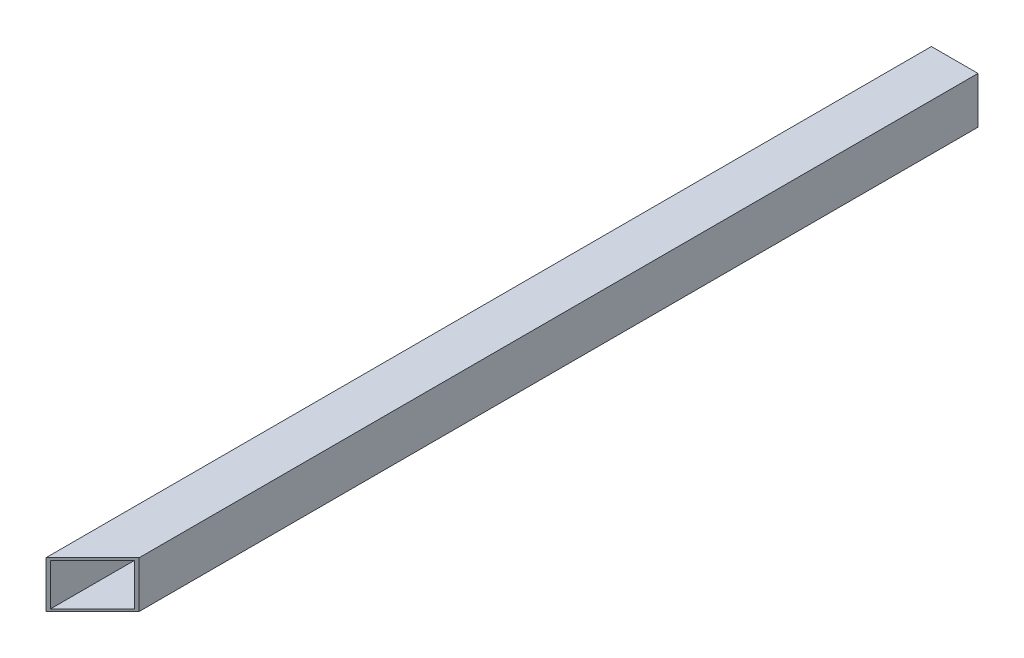
ISO-10303-21;
HEADER;
FILE_DESCRIPTION(('STEP AP214'),'2;1');
FILE_NAME('part.step','',(''),(''),'','','');
FILE_SCHEMA(('AUTOMOTIVE_DESIGN { 1 0 10303 214 1 1 1 1 }'));
ENDSEC;
DATA;
#1=APPLICATION_CONTEXT('core data for automotive mechanical design processes');
#2=APPLICATION_PROTOCOL_DEFINITION('international standard','automotive_design',2000,#1);
#3=PRODUCT_CONTEXT('',#1,'mechanical');
#4=PRODUCT('Part','Part','',(#3));
#5=PRODUCT_RELATED_PRODUCT_CATEGORY('part','',(#4));
#6=PRODUCT_DEFINITION_FORMATION('','',#4);
#7=PRODUCT_DEFINITION_CONTEXT('part definition',#1,'design');
#8=PRODUCT_DEFINITION('design','',#6,#7);
#9=PRODUCT_DEFINITION_SHAPE('','',#8);
#10=(LENGTH_UNIT() NAMED_UNIT(*) SI_UNIT(.MILLI.,.METRE.));
#11=(NAMED_UNIT(*) PLANE_ANGLE_UNIT() SI_UNIT($,.RADIAN.));
#12=(NAMED_UNIT(*) SI_UNIT($,.STERADIAN.) SOLID_ANGLE_UNIT());
#13=UNCERTAINTY_MEASURE_WITH_UNIT(LENGTH_MEASURE(1.E-05),#10,'distance_accuracy_value','');
#14=(GEOMETRIC_REPRESENTATION_CONTEXT(3) GLOBAL_UNCERTAINTY_ASSIGNED_CONTEXT((#13)) GLOBAL_UNIT_ASSIGNED_CONTEXT((#10,
#11,#12)) REPRESENTATION_CONTEXT('',''));
#15=CARTESIAN_POINT('',(0.,0.,0.));
#16=DIRECTION('',(0.,0.,1.));
#17=DIRECTION('',(1.,0.,0.));
#18=AXIS2_PLACEMENT_3D('',#15,#16,#17);
#19=CARTESIAN_POINT('',(0.,0.,0.));
#20=DIRECTION('',(0.,0.,-1.));
#21=DIRECTION('',(-1.,0.,0.));
#22=AXIS2_PLACEMENT_3D('',#19,#20,#21);
#23=PLANE('',#22);
#24=DIRECTION('',(0.,1.,0.));
#25=VECTOR('',#24,1.);
#26=CARTESIAN_POINT('',(12.7,-12.7,0.));
#27=LINE('',#26,#25);
#28=CARTESIAN_POINT('',(12.7,-12.7,0.));
#29=VERTEX_POINT('',#28);
#30=CARTESIAN_POINT('',(12.7,12.7,0.));
#31=VERTEX_POINT('',#30);
#32=EDGE_CURVE('E146',#29,#31,#27,.T.);
#33=ORIENTED_EDGE('',*,*,#32,.F.);
#34=DIRECTION('',(1.,0.,0.));
#35=VECTOR('',#34,1.);
#36=CARTESIAN_POINT('',(-12.7,-12.7,0.));
#37=LINE('',#36,#35);
#38=CARTESIAN_POINT('',(-12.7,-12.7,0.));
#39=VERTEX_POINT('',#38);
#40=EDGE_CURVE('E134',#39,#29,#37,.T.);
#41=ORIENTED_EDGE('',*,*,#40,.F.);
#42=DIRECTION('',(0.,-1.,0.));
#43=VECTOR('',#42,1.);
#44=CARTESIAN_POINT('',(-12.7,-12.7,0.));
#45=LINE('',#44,#43);
#46=CARTESIAN_POINT('',(-12.7,12.7,0.));
#47=VERTEX_POINT('',#46);
#48=EDGE_CURVE('E140',#47,#39,#45,.T.);
#49=ORIENTED_EDGE('',*,*,#48,.F.);
#50=DIRECTION('',(-1.,0.,0.));
#51=VECTOR('',#50,1.);
#52=CARTESIAN_POINT('',(-12.7,12.7,0.));
#53=LINE('',#52,#51);
#54=EDGE_CURVE('E123',#31,#47,#53,.T.);
#55=ORIENTED_EDGE('',*,*,#54,.F.);
#56=EDGE_LOOP('',(#33,#41,#49,#55));
#57=FACE_BOUND('',#56,.T.);
#58=DIRECTION('',(1.,0.,0.));
#59=VECTOR('',#58,1.);
#60=CARTESIAN_POINT('',(-11.4554,-11.4554,0.));
#61=LINE('',#60,#59);
#62=CARTESIAN_POINT('',(-11.4554,-11.4554,0.));
#63=VERTEX_POINT('',#62);
#64=CARTESIAN_POINT('',(11.4554,-11.4554,0.));
#65=VERTEX_POINT('',#64);
#66=EDGE_CURVE('E189',#63,#65,#61,.T.);
#67=ORIENTED_EDGE('',*,*,#66,.T.);
#68=DIRECTION('',(0.,1.,0.));
#69=VECTOR('',#68,1.);
#70=CARTESIAN_POINT('',(11.4554,11.4554,0.));
#71=LINE('',#70,#69);
#72=CARTESIAN_POINT('',(11.4554,11.4554,0.));
#73=VERTEX_POINT('',#72);
#74=EDGE_CURVE('E177',#65,#73,#71,.T.);
#75=ORIENTED_EDGE('',*,*,#74,.T.);
#76=DIRECTION('',(-1.,0.,0.));
#77=VECTOR('',#76,1.);
#78=CARTESIAN_POINT('',(-11.4554,11.4554,0.));
#79=LINE('',#78,#77);
#80=CARTESIAN_POINT('',(-11.4554,11.4554,0.));
#81=VERTEX_POINT('',#80);
#82=EDGE_CURVE('E181',#73,#81,#79,.T.);
#83=ORIENTED_EDGE('',*,*,#82,.T.);
#84=DIRECTION('',(0.,-1.,0.));
#85=VECTOR('',#84,1.);
#86=CARTESIAN_POINT('',(-11.4554,11.4554,0.));
#87=LINE('',#86,#85);
#88=EDGE_CURVE('E185',#81,#63,#87,.T.);
#89=ORIENTED_EDGE('',*,*,#88,.T.);
#90=EDGE_LOOP('',(#67,#75,#83,#89));
#91=FACE_BOUND('',#90,.T.);
#92=ADVANCED_FACE('F41',(#57,#91),#23,.T.);
#93=CARTESIAN_POINT('',(12.7,-12.7,482.6));
#94=DIRECTION('',(-1.,0.,0.));
#95=DIRECTION('',(0.,0.,1.));
#96=AXIS2_PLACEMENT_3D('',#93,#94,#95);
#97=PLANE('',#96);
#98=DIRECTION('',(0.,0.,-1.));
#99=VECTOR('',#98,1.);
#100=CARTESIAN_POINT('',(12.7,12.7,482.6));
#101=LINE('',#100,#99);
#102=CARTESIAN_POINT('',(12.7000000000001,12.7,457.2));
#103=VERTEX_POINT('',#102);
#104=EDGE_CURVE('E50',#103,#31,#101,.T.);
#105=ORIENTED_EDGE('',*,*,#104,.F.);
#106=DIRECTION('',(0.,-1.,0.));
#107=VECTOR('',#106,1.);
#108=CARTESIAN_POINT('',(12.7,-12.7,457.2));
#109=LINE('',#108,#107);
#110=CARTESIAN_POINT('',(12.7000000000001,-12.7,457.2));
#111=VERTEX_POINT('',#110);
#112=EDGE_CURVE('E113',#103,#111,#109,.T.);
#113=ORIENTED_EDGE('',*,*,#112,.T.);
#114=DIRECTION('',(0.,0.,-1.));
#115=VECTOR('',#114,1.);
#116=CARTESIAN_POINT('',(12.7,-12.7,482.6));
#117=LINE('',#116,#115);
#118=EDGE_CURVE('E133',#111,#29,#117,.T.);
#119=ORIENTED_EDGE('',*,*,#118,.T.);
#120=ORIENTED_EDGE('',*,*,#32,.T.);
#121=EDGE_LOOP('',(#105,#113,#119,#120));
#122=FACE_BOUND('',#121,.T.);
#123=ADVANCED_FACE('F43',(#122),#97,.F.);
#124=CARTESIAN_POINT('',(-12.7,12.7,482.6));
#125=DIRECTION('',(0.,-1.,0.));
#126=DIRECTION('',(0.,0.,-1.));
#127=AXIS2_PLACEMENT_3D('',#124,#125,#126);
#128=PLANE('',#127);
#129=DIRECTION('',(0.,0.,-1.));
#130=VECTOR('',#129,1.);
#131=CARTESIAN_POINT('',(-12.7,12.7,482.6));
#132=LINE('',#131,#130);
#133=CARTESIAN_POINT('',(-12.7,12.7,482.6));
#134=VERTEX_POINT('',#133);
#135=EDGE_CURVE('E120',#134,#47,#132,.T.);
#136=ORIENTED_EDGE('',*,*,#135,.F.);
#137=DIRECTION('',(-0.707106781186549,0.,0.707106781186546));
#138=VECTOR('',#137,1.);
#139=CARTESIAN_POINT('',(328.549732600628,12.7,141.350267399373));
#140=LINE('',#139,#138);
#141=EDGE_CURVE('E106',#103,#134,#140,.T.);
#142=ORIENTED_EDGE('',*,*,#141,.F.);
#143=ORIENTED_EDGE('',*,*,#104,.T.);
#144=ORIENTED_EDGE('',*,*,#54,.T.);
#145=EDGE_LOOP('',(#136,#142,#143,#144));
#146=FACE_BOUND('',#145,.T.);
#147=ADVANCED_FACE('F121',(#146),#128,.F.);
#148=CARTESIAN_POINT('',(-12.7,-12.7,482.6));
#149=DIRECTION('',(1.,0.,0.));
#150=DIRECTION('',(0.,0.,-1.));
#151=AXIS2_PLACEMENT_3D('',#148,#149,#150);
#152=PLANE('',#151);
#153=ORIENTED_EDGE('',*,*,#48,.T.);
#154=DIRECTION('',(0.,0.,-1.));
#155=VECTOR('',#154,1.);
#156=CARTESIAN_POINT('',(-12.7,-12.7,482.6));
#157=LINE('',#156,#155);
#158=CARTESIAN_POINT('',(-12.7,-12.7,482.6));
#159=VERTEX_POINT('',#158);
#160=EDGE_CURVE('E127',#159,#39,#157,.T.);
#161=ORIENTED_EDGE('',*,*,#160,.F.);
#162=DIRECTION('',(0.,-1.,0.));
#163=VECTOR('',#162,1.);
#164=CARTESIAN_POINT('',(-12.7,-12.7,482.6));
#165=LINE('',#164,#163);
#166=EDGE_CURVE('E110',#134,#159,#165,.T.);
#167=ORIENTED_EDGE('',*,*,#166,.F.);
#168=ORIENTED_EDGE('',*,*,#135,.T.);
#169=EDGE_LOOP('',(#153,#161,#167,#168));
#170=FACE_BOUND('',#169,.T.);
#171=ADVANCED_FACE('F130',(#170),#152,.F.);
#172=CARTESIAN_POINT('',(-12.7,-12.7,482.6));
#173=DIRECTION('',(0.,1.,0.));
#174=DIRECTION('',(0.,0.,1.));
#175=AXIS2_PLACEMENT_3D('',#172,#173,#174);
#176=PLANE('',#175);
#177=ORIENTED_EDGE('',*,*,#118,.F.);
#178=DIRECTION('',(-0.707106781186549,0.,0.707106781186546));
#179=VECTOR('',#178,1.);
#180=CARTESIAN_POINT('',(328.549732600628,-12.7,141.350267399373));
#181=LINE('',#180,#179);
#182=EDGE_CURVE('E117',#111,#159,#181,.T.);
#183=ORIENTED_EDGE('',*,*,#182,.T.);
#184=ORIENTED_EDGE('',*,*,#160,.T.);
#185=ORIENTED_EDGE('',*,*,#40,.T.);
#186=EDGE_LOOP('',(#177,#183,#184,#185));
#187=FACE_BOUND('',#186,.T.);
#188=ADVANCED_FACE('F163',(#187),#176,.F.);
#189=CARTESIAN_POINT('',(11.4554,11.4554,482.6));
#190=DIRECTION('',(-1.,0.,0.));
#191=DIRECTION('',(0.,-1.,0.));
#192=AXIS2_PLACEMENT_3D('',#189,#190,#191);
#193=PLANE('',#192);
#194=DIRECTION('',(0.,-1.,0.));
#195=VECTOR('',#194,1.);
#196=CARTESIAN_POINT('',(11.4554,11.4554,458.4446));
#197=LINE('',#196,#195);
#198=CARTESIAN_POINT('',(11.4554,11.4554,458.4446));
#199=VERTEX_POINT('',#198);
#200=CARTESIAN_POINT('',(11.4554,-11.4554,458.4446));
#201=VERTEX_POINT('',#200);
#202=EDGE_CURVE('E56',#199,#201,#197,.T.);
#203=ORIENTED_EDGE('',*,*,#202,.F.);
#204=DIRECTION('',(0.,0.,-1.));
#205=VECTOR('',#204,1.);
#206=CARTESIAN_POINT('',(11.4554,11.4554,482.6));
#207=LINE('',#206,#205);
#208=EDGE_CURVE('E144',#199,#73,#207,.T.);
#209=ORIENTED_EDGE('',*,*,#208,.T.);
#210=ORIENTED_EDGE('',*,*,#74,.F.);
#211=DIRECTION('',(0.,0.,-1.));
#212=VECTOR('',#211,1.);
#213=CARTESIAN_POINT('',(11.4554,-11.4554,482.6));
#214=LINE('',#213,#212);
#215=EDGE_CURVE('E63',#201,#65,#214,.T.);
#216=ORIENTED_EDGE('',*,*,#215,.F.);
#217=EDGE_LOOP('',(#203,#209,#210,#216));
#218=FACE_BOUND('',#217,.T.);
#219=ADVANCED_FACE('F207',(#218),#193,.T.);
#220=CARTESIAN_POINT('',(-11.4554,11.4554,482.6));
#221=DIRECTION('',(0.,-1.,0.));
#222=DIRECTION('',(0.,0.,-1.));
#223=AXIS2_PLACEMENT_3D('',#220,#221,#222);
#224=PLANE('',#223);
#225=DIRECTION('',(0.707106781186549,0.,-0.707106781186546));
#226=VECTOR('',#225,1.);
#227=CARTESIAN_POINT('',(-12.0777,11.4554,481.9777));
#228=LINE('',#227,#226);
#229=CARTESIAN_POINT('',(-11.4554,11.4554,481.3554));
#230=VERTEX_POINT('',#229);
#231=EDGE_CURVE('E168',#230,#199,#228,.T.);
#232=ORIENTED_EDGE('',*,*,#231,.F.);
#233=DIRECTION('',(0.,0.,-1.));
#234=VECTOR('',#233,1.);
#235=CARTESIAN_POINT('',(-11.4554,11.4554,482.6));
#236=LINE('',#235,#234);
#237=EDGE_CURVE('E197',#230,#81,#236,.T.);
#238=ORIENTED_EDGE('',*,*,#237,.T.);
#239=ORIENTED_EDGE('',*,*,#82,.F.);
#240=ORIENTED_EDGE('',*,*,#208,.F.);
#241=EDGE_LOOP('',(#232,#238,#239,#240));
#242=FACE_BOUND('',#241,.T.);
#243=ADVANCED_FACE('F208',(#242),#224,.T.);
#244=CARTESIAN_POINT('',(-11.4554,11.4554,482.6));
#245=DIRECTION('',(1.,0.,0.));
#246=DIRECTION('',(0.,1.,0.));
#247=AXIS2_PLACEMENT_3D('',#244,#245,#246);
#248=PLANE('',#247);
#249=DIRECTION('',(0.,1.,0.));
#250=VECTOR('',#249,1.);
#251=CARTESIAN_POINT('',(-11.4554,11.4554,481.3554));
#252=LINE('',#251,#250);
#253=CARTESIAN_POINT('',(-11.4554,-11.4554,481.3554));
#254=VERTEX_POINT('',#253);
#255=EDGE_CURVE('E165',#254,#230,#252,.T.);
#256=ORIENTED_EDGE('',*,*,#255,.F.);
#257=DIRECTION('',(0.,0.,-1.));
#258=VECTOR('',#257,1.);
#259=CARTESIAN_POINT('',(-11.4554,-11.4554,482.6));
#260=LINE('',#259,#258);
#261=EDGE_CURVE('E195',#254,#63,#260,.T.);
#262=ORIENTED_EDGE('',*,*,#261,.T.);
#263=ORIENTED_EDGE('',*,*,#88,.F.);
#264=ORIENTED_EDGE('',*,*,#237,.F.);
#265=EDGE_LOOP('',(#256,#262,#263,#264));
#266=FACE_BOUND('',#265,.T.);
#267=ADVANCED_FACE('F213',(#266),#248,.T.);
#268=CARTESIAN_POINT('',(-11.4554,-11.4554,482.6));
#269=DIRECTION('',(0.,1.,0.));
#270=DIRECTION('',(0.,0.,1.));
#271=AXIS2_PLACEMENT_3D('',#268,#269,#270);
#272=PLANE('',#271);
#273=DIRECTION('',(-0.707106781186549,0.,0.707106781186546));
#274=VECTOR('',#273,1.);
#275=CARTESIAN_POINT('',(-12.0777,-11.4554,481.9777));
#276=LINE('',#275,#274);
#277=EDGE_CURVE('E11',#201,#254,#276,.T.);
#278=ORIENTED_EDGE('',*,*,#277,.F.);
#279=ORIENTED_EDGE('',*,*,#215,.T.);
#280=ORIENTED_EDGE('',*,*,#66,.F.);
#281=ORIENTED_EDGE('',*,*,#261,.F.);
#282=EDGE_LOOP('',(#278,#279,#280,#281));
#283=FACE_BOUND('',#282,.T.);
#284=ADVANCED_FACE('F210',(#283),#272,.T.);
#285=CARTESIAN_POINT('',(328.549732600628,12.7,141.350267399373));
#286=DIRECTION('',(-0.707106781186546,0.,-0.707106781186549));
#287=DIRECTION('',(-0.707106781186549,0.,0.707106781186546));
#288=AXIS2_PLACEMENT_3D('',#285,#286,#287);
#289=PLANE('',#288);
#290=ORIENTED_EDGE('',*,*,#202,.T.);
#291=ORIENTED_EDGE('',*,*,#277,.T.);
#292=ORIENTED_EDGE('',*,*,#255,.T.);
#293=ORIENTED_EDGE('',*,*,#231,.T.);
#294=EDGE_LOOP('',(#290,#291,#292,#293));
#295=FACE_BOUND('',#294,.T.);
#296=ORIENTED_EDGE('',*,*,#141,.T.);
#297=ORIENTED_EDGE('',*,*,#166,.T.);
#298=ORIENTED_EDGE('',*,*,#182,.F.);
#299=ORIENTED_EDGE('',*,*,#112,.F.);
#300=EDGE_LOOP('',(#296,#297,#298,#299));
#301=FACE_BOUND('',#300,.T.);
#302=ADVANCED_FACE('F108',(#295,#301),#289,.F.);
#303=CLOSED_SHELL('',(#92,#123,#147,#171,#188,#219,#243,#267,#284,#302));
#304=MANIFOLD_SOLID_BREP('B2',#303);
#305=ADVANCED_BREP_SHAPE_REPRESENTATION('',(#18,#304),#14);
#306=SHAPE_DEFINITION_REPRESENTATION(#9,#305);
ENDSEC;
END-ISO-10303-21;
